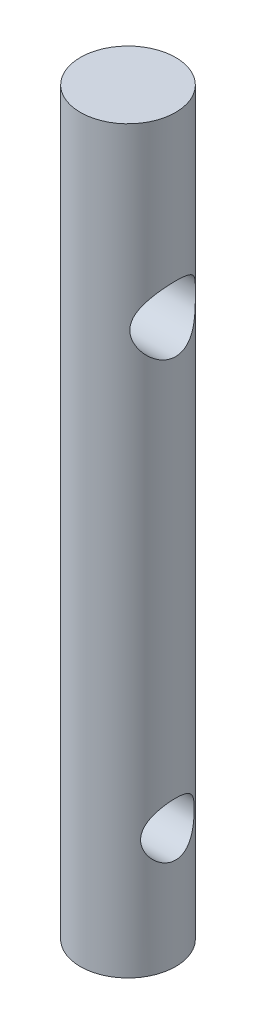
ISO-10303-21;
HEADER;
FILE_DESCRIPTION(('STEP AP214'),'2;1');
FILE_NAME('part.step','',(''),(''),'','','');
FILE_SCHEMA(('AUTOMOTIVE_DESIGN { 1 0 10303 214 1 1 1 1 }'));
ENDSEC;
DATA;
#1=APPLICATION_CONTEXT('core data for automotive mechanical design processes');
#2=APPLICATION_PROTOCOL_DEFINITION('international standard','automotive_design',2000,#1);
#3=PRODUCT_CONTEXT('',#1,'mechanical');
#4=PRODUCT('Part','Part','',(#3));
#5=PRODUCT_RELATED_PRODUCT_CATEGORY('part','',(#4));
#6=PRODUCT_DEFINITION_FORMATION('','',#4);
#7=PRODUCT_DEFINITION_CONTEXT('part definition',#1,'design');
#8=PRODUCT_DEFINITION('design','',#6,#7);
#9=PRODUCT_DEFINITION_SHAPE('','',#8);
#10=(LENGTH_UNIT() NAMED_UNIT(*) SI_UNIT(.MILLI.,.METRE.));
#11=(NAMED_UNIT(*) PLANE_ANGLE_UNIT() SI_UNIT($,.RADIAN.));
#12=(NAMED_UNIT(*) SI_UNIT($,.STERADIAN.) SOLID_ANGLE_UNIT());
#13=UNCERTAINTY_MEASURE_WITH_UNIT(LENGTH_MEASURE(1.E-05),#10,'distance_accuracy_value','');
#14=(GEOMETRIC_REPRESENTATION_CONTEXT(3) GLOBAL_UNCERTAINTY_ASSIGNED_CONTEXT((#13)) GLOBAL_UNIT_ASSIGNED_CONTEXT((#10,
#11,#12)) REPRESENTATION_CONTEXT('',''));
#15=CARTESIAN_POINT('',(0.,0.,0.));
#16=DIRECTION('',(0.,0.,1.));
#17=DIRECTION('',(1.,0.,0.));
#18=AXIS2_PLACEMENT_3D('',#15,#16,#17);
#19=CARTESIAN_POINT('',(0.,62.1,0.));
#20=DIRECTION('',(0.,-1.,0.));
#21=DIRECTION('',(0.,0.,-1.));
#22=AXIS2_PLACEMENT_3D('',#19,#20,#21);
#23=CYLINDRICAL_SURFACE('',#22,4.);
#24=CARTESIAN_POINT('',(4.,7.75000000000001,0.));
#25=CARTESIAN_POINT('',(4.00000478544653,7.74999453130518,0.116574361582472));
#26=CARTESIAN_POINT('',(3.99486161015437,7.7590981789772,0.233117494271239));
#27=CARTESIAN_POINT('',(3.97483223454772,7.79500258941546,0.462569233089477));
#28=CARTESIAN_POINT('',(3.95994512022037,7.8218050123859,0.575477497214019));
#29=CARTESIAN_POINT('',(3.92194301780639,7.89168584037628,0.794135368983557));
#30=CARTESIAN_POINT('',(3.89885841586878,7.93470417260667,0.899909720053429));
#31=CARTESIAN_POINT('',(3.84647695565079,8.03538019365043,1.10253378507156));
#32=CARTESIAN_POINT('',(3.81717856353268,8.09304149769058,1.19938128699593));
#33=CARTESIAN_POINT('',(3.75249587564385,8.22592775009536,1.38906915002198));
#34=CARTESIAN_POINT('',(3.71682789510745,8.30210554672397,1.48114339668484));
#35=CARTESIAN_POINT('',(3.64413342628144,8.46776263700002,1.65194589061997));
#36=CARTESIAN_POINT('',(3.60710555491407,8.55725577196237,1.73066006559967));
#37=CARTESIAN_POINT('',(3.53132973794817,8.7580941708652,1.88082299052421));
#38=CARTESIAN_POINT('',(3.49280663301793,8.87074581752852,1.95065199991236));
#39=CARTESIAN_POINT('',(3.42338878308605,9.10842284430669,2.07007441099025));
#40=CARTESIAN_POINT('',(3.39248289010151,9.23342976195331,2.11969745487576));
#41=CARTESIAN_POINT('',(3.34873790347699,9.46472296594284,2.18797418220357));
#42=CARTESIAN_POINT('',(3.33344311646643,9.56925606283551,2.21099236506624));
#43=CARTESIAN_POINT('',(3.31272698675541,9.78145422778595,2.24191937059644));
#44=CARTESIAN_POINT('',(3.30729555624901,9.88911598132565,2.24984363106812));
#45=CARTESIAN_POINT('',(3.30708570593103,10.1045987035378,2.25015198203818));
#46=CARTESIAN_POINT('',(3.31232016010623,10.2124197074614,2.24251729249723));
#47=CARTESIAN_POINT('',(3.33269723151075,10.4249625744304,2.21211443713199));
#48=CARTESIAN_POINT('',(3.34784644914888,10.529682324348,2.18933618985118));
#49=CARTESIAN_POINT('',(3.38603292300512,10.7333027654873,2.12979203835403));
#50=CARTESIAN_POINT('',(3.40905841136274,10.8322118814631,2.09304699274244));
#51=CARTESIAN_POINT('',(3.46051165794458,11.0227794777977,2.00683191613315));
#52=CARTESIAN_POINT('',(3.48894150865605,11.1144351301926,1.95735695367262));
#53=CARTESIAN_POINT('',(3.55335821820066,11.3030329597275,1.83818085300224));
#54=CARTESIAN_POINT('',(3.58983262447658,11.3985786540699,1.76653038669177));
#55=CARTESIAN_POINT('',(3.66310576724814,11.577175923867,1.60910062289686));
#56=CARTESIAN_POINT('',(3.69990474528988,11.6602171841263,1.52330978155465));
#57=CARTESIAN_POINT('',(3.77433344135285,11.8203414864716,1.32903508462716));
#58=CARTESIAN_POINT('',(3.81163274215655,11.8958430174917,1.21910653825672));
#59=CARTESIAN_POINT('',(3.8785102897696,12.0269493359196,0.985819808739913));
#60=CARTESIAN_POINT('',(3.90809353555846,12.0825670141272,0.862470394320824));
#61=CARTESIAN_POINT('',(3.95433282446718,12.1680512248964,0.614802935181407));
#62=CARTESIAN_POINT('',(3.97175099800325,12.1994522774439,0.491161652101949));
#63=CARTESIAN_POINT('',(3.99482968000702,12.2408638905754,0.239312439490547));
#64=CARTESIAN_POINT('',(4.0005010871484,12.2508942791528,0.111108855331867));
#65=CARTESIAN_POINT('',(3.99948985429328,12.2490900194052,-0.13004078307406));
#66=CARTESIAN_POINT('',(3.99417274413828,12.2396722780858,-0.243020002233855));
#67=CARTESIAN_POINT('',(3.97439096014101,12.2042007521307,-0.465494282379478));
#68=CARTESIAN_POINT('',(3.95992604703182,12.1781465323566,-0.574989252153744));
#69=CARTESIAN_POINT('',(3.92328872220358,12.1108014960461,-0.786967121562118));
#70=CARTESIAN_POINT('',(3.90116658018562,12.0696099498368,-0.889490661546794));
#71=CARTESIAN_POINT('',(3.85101918921102,11.9734562382392,-1.08626635912844));
#72=CARTESIAN_POINT('',(3.82299243073654,11.9184905508034,-1.18051639285429));
#73=CARTESIAN_POINT('',(3.76002936312769,11.7899122191325,-1.36857667308343));
#74=CARTESIAN_POINT('',(3.7246780024892,11.7149574830262,-1.46132919322936));
#75=CARTESIAN_POINT('',(3.65238471184595,11.5517004840577,-1.63365800644759));
#76=CARTESIAN_POINT('',(3.61544103187715,11.4633832537326,-1.71321931178773));
#77=CARTESIAN_POINT('',(3.53951439409258,11.2648897896172,-1.86542341442178));
#78=CARTESIAN_POINT('',(3.50072726004721,11.1533905499058,-1.93645169791217));
#79=CARTESIAN_POINT('',(3.43037744626153,10.9178923077855,-2.05851857364412));
#80=CARTESIAN_POINT('',(3.39880480330901,10.793910888565,-2.10958480364701));
#81=CARTESIAN_POINT('',(3.35340305197012,10.563667865818,-2.18084463813156));
#82=CARTESIAN_POINT('',(3.33723657165908,10.4591803754072,-2.20527701624258));
#83=CARTESIAN_POINT('',(3.31471067608655,10.2467957415048,-2.23899995281605));
#84=CARTESIAN_POINT('',(3.30834087137768,10.1389023341522,-2.24830655287419));
#85=CARTESIAN_POINT('',(3.30632360585781,9.92262955911016,-2.25127274506087));
#86=CARTESIAN_POINT('',(3.31069292179551,9.81424969541507,-2.24490785502245));
#87=CARTESIAN_POINT('',(3.32953789725069,9.60037404467416,-2.21685577078293));
#88=CARTESIAN_POINT('',(3.34402001448016,9.4948801452687,-2.19515878588968));
#89=CARTESIAN_POINT('',(3.38097911212604,9.29037151006926,-2.13778330318558));
#90=CARTESIAN_POINT('',(3.40338287245248,9.19130695507592,-2.10223255881956));
#91=CARTESIAN_POINT('',(3.45375909402076,9.00026943468902,-2.01839895296499));
#92=CARTESIAN_POINT('',(3.48173366583132,8.90829917543204,-1.9701112636748));
#93=CARTESIAN_POINT('',(3.54527276452029,8.71915337792142,-1.85366513948028));
#94=CARTESIAN_POINT('',(3.58134425635897,8.62332096321644,-1.78359984700069));
#95=CARTESIAN_POINT('',(3.65407566781854,8.44388148560471,-1.62941913124429));
#96=CARTESIAN_POINT('',(3.69073604531761,8.36028450307825,-1.54529224392736));
#97=CARTESIAN_POINT('',(3.76540884250455,8.19818149303695,-1.354021465717));
#98=CARTESIAN_POINT('',(3.80310734128129,8.12131329772804,-1.24535169109797));
#99=CARTESIAN_POINT('',(3.87110760658433,7.98721203787693,-1.01438833074298));
#100=CARTESIAN_POINT('',(3.90141321037509,7.92996878077582,-0.892101860933931));
#101=CARTESIAN_POINT('',(3.94980432815978,7.84018245187761,-0.643615229722407));
#102=CARTESIAN_POINT('',(3.9684273957593,7.80654270214637,-0.517920543452162));
#103=CARTESIAN_POINT('',(3.99351673701052,7.76146515633489,-0.261467507514435));
#104=CARTESIAN_POINT('',(3.99999463410795,7.75000613201422,-0.130714121712679));
#105=CARTESIAN_POINT('',(4.,7.75000000000001,0.));
#106=B_SPLINE_CURVE_WITH_KNOTS('',3,(#24,#25,#26,#27,#28,#29,#30,#31,#32,#33,#34,#35,#36,#37,
#38,#39,#40,#41,#42,#43,#44,#45,#46,#47,#48,#49,#50,#51,#52,#53,#54,#55,#56,#57,#58,#59,#60,#61,
#62,#63,#64,#65,#66,#67,#68,#69,#70,#71,#72,#73,#74,#75,#76,#77,#78,#79,#80,#81,#82,#83,#84,#85,
#86,#87,#88,#89,#90,#91,#92,#93,#94,#95,#96,#97,#98,#99,#100,#101,#102,#103,#104,#105),
.UNSPECIFIED.,.T.,.F.,(4,2,2,2,2,2,2,2,2,2,2,2,2,2,2,2,2,2,2,2,2,2,2,2,2,2,2,2,2,2,2,2,2,2,2,2,
2,2,2,2,4),(0.,0.349217040261903,0.698466842902346,1.04643534535527,1.39448984197479,
1.76712658025474,2.14015341686606,2.5521761075332,2.96359216327473,3.28655752035713,
3.60919237628562,3.93221689114865,4.25545666737862,4.57821558845878,4.90109973238011,
5.27422406620246,5.64765453225214,6.06093560472621,6.47394825708697,6.85794726055586,
7.24158982908579,7.58042476019115,7.91926855411823,8.25592875611158,8.59267513010329,
8.96431825134707,9.33638077847353,9.74768136660233,10.158410468765,10.4825563002443,
10.8063581350408,11.1306661373325,11.4551814219642,11.7767724027847,12.0984854548004,
12.4692322109723,12.8402827146263,13.2531861325241,13.6658747756936,14.0578250211793,
14.4493999617175),.UNSPECIFIED.);
#107=CARTESIAN_POINT('',(4.,7.75000000000001,0.));
#108=VERTEX_POINT('',#107);
#109=EDGE_CURVE('E10',#108,#108,#106,.T.);
#110=ORIENTED_EDGE('',*,*,#109,.T.);
#111=EDGE_LOOP('',(#110));
#112=FACE_BOUND('',#111,.T.);
#113=CARTESIAN_POINT('',(-3.30718913883074,10.,2.24999999999999));
#114=CARTESIAN_POINT('',(-3.30720283164235,9.88520822701399,2.24998998597615));
#115=CARTESIAN_POINT('',(-3.31326199057818,9.77032319902401,2.24115272144871));
#116=CARTESIAN_POINT('',(-3.33653258979889,9.54428040268576,2.20634454496227));
#117=CARTESIAN_POINT('',(-3.35376180964137,9.43312887419174,2.18034631643425));
#118=CARTESIAN_POINT('',(-3.39669677819684,9.21828250266168,2.11282374112489));
#119=CARTESIAN_POINT('',(-3.42234732234414,9.11454431690225,2.07140028056063));
#120=CARTESIAN_POINT('',(-3.47914410853277,8.91553589249748,1.97451321653586));
#121=CARTESIAN_POINT('',(-3.51029165708196,8.82026767507596,1.91904627390682));
#122=CARTESIAN_POINT('',(-3.57858292165988,8.62978631391552,1.78877118435164));
#123=CARTESIAN_POINT('',(-3.61601218998279,8.53565168519916,1.71253525749273));
#124=CARTESIAN_POINT('',(-3.69035883366655,8.36063158701421,1.54582974413932));
#125=CARTESIAN_POINT('',(-3.72727587335664,8.27975446175999,1.45535126312722));
#126=CARTESIAN_POINT('',(-3.80043905611031,8.12628851476165,1.25270944953698));
#127=CARTESIAN_POINT('',(-3.83631825888132,8.05512422844991,1.13932192166405));
#128=CARTESIAN_POINT('',(-3.89944625108567,7.93338570613169,0.899782666076097));
#129=CARTESIAN_POINT('',(-3.92670191534241,7.88279505926147,0.773641212406467));
#130=CARTESIAN_POINT('',(-3.96741508551211,7.8082500957617,0.523681584622888));
#131=CARTESIAN_POINT('',(-3.98185970105235,7.78237518549638,0.400600921300551));
#132=CARTESIAN_POINT('',(-3.9990959232521,7.75156921051223,0.151075971454805));
#133=CARTESIAN_POINT('',(-4.0018968673342,7.74662136367429,0.0246344620294684));
#134=CARTESIAN_POINT('',(-3.99589303432293,7.75730848266808,-0.213146431029538));
#135=CARTESIAN_POINT('',(-3.98832428191024,7.77075111662831,-0.324624825144539));
#136=CARTESIAN_POINT('',(-3.96444074773096,7.8137679790799,-0.543435301884435));
#137=CARTESIAN_POINT('',(-3.94812528853831,7.84334345705135,-0.650767062665244));
#138=CARTESIAN_POINT('',(-3.90798978670721,7.91772458957311,-0.859682291790886));
#139=CARTESIAN_POINT('',(-3.88409842608767,7.96267531365288,-0.961199838960673));
#140=CARTESIAN_POINT('',(-3.83081347415684,8.06619567475389,-1.155432954149));
#141=CARTESIAN_POINT('',(-3.80141819640327,8.12476948732926,-1.24814581118481));
#142=CARTESIAN_POINT('',(-3.73587457924302,8.26125437019958,-1.43314551789953));
#143=CARTESIAN_POINT('',(-3.69933884152572,8.34058984718902,-1.52424389574508));
#144=CARTESIAN_POINT('',(-3.62542637052535,8.51263634619458,-1.69255803147124));
#145=CARTESIAN_POINT('',(-3.58804875665274,8.60536198015369,-1.76975841374624));
#146=CARTESIAN_POINT('',(-3.51263905953386,8.8120334436418,-1.91538550764547));
#147=CARTESIAN_POINT('',(-3.47487862633156,8.92715634881863,-1.98229476058775));
#148=CARTESIAN_POINT('',(-3.40788863495859,9.16956083210203,-2.09539020948197));
#149=CARTESIAN_POINT('',(-3.37864921243183,9.29682812275862,-2.14160040128731));
#150=CARTESIAN_POINT('',(-3.34594244401029,9.4887065817242,-2.192034467537));
#151=CARTESIAN_POINT('',(-3.33707999891524,9.5500976490126,-2.20546205088502));
#152=CARTESIAN_POINT('',(-3.32263419547036,9.67414906438363,-2.22716773841207));
#153=CARTESIAN_POINT('',(-3.31704887169847,9.73680862832017,-2.23544892926733));
#154=CARTESIAN_POINT('',(-3.30943885611997,9.86276708191362,-2.24670015251964));
#155=CARTESIAN_POINT('',(-3.30741116514912,9.92606538777096,-2.2496746586066));
#156=CARTESIAN_POINT('',(-3.30700126925191,10.0526779848783,-2.25027513604798));
#157=CARTESIAN_POINT('',(-3.30861861678419,10.1159922732116,-2.24790176402007));
#158=CARTESIAN_POINT('',(-3.3177883182366,10.2853682614947,-2.23437139368501));
#159=CARTESIAN_POINT('',(-3.32865531872577,10.3909074810053,-2.21829925748997));
#160=CARTESIAN_POINT('',(-3.35915029085187,10.5973960787567,-2.17183241579351));
#161=CARTESIAN_POINT('',(-3.37878247892555,10.6983432222265,-2.14143081680422));
#162=CARTESIAN_POINT('',(-3.42541559308764,10.8976287403227,-2.06604953338091));
#163=CARTESIAN_POINT('',(-3.45267969832011,10.9957015414302,-2.02053570089111));
#164=CARTESIAN_POINT('',(-3.51140559505348,11.1834001059593,-1.9166607669257));
#165=CARTESIAN_POINT('',(-3.54286939186899,11.2730217989495,-1.85829351935498));
#166=CARTESIAN_POINT('',(-3.61274572393316,11.4569968907179,-1.71903976804869));
#167=CARTESIAN_POINT('',(-3.65144050737585,11.5496360940029,-1.63601976355696));
#168=CARTESIAN_POINT('',(-3.72711451802446,11.7203905482922,-1.45540802432558));
#169=CARTESIAN_POINT('',(-3.7640926038568,11.7984962373817,-1.35780677185052));
#170=CARTESIAN_POINT('',(-3.83478893396541,11.9422273955657,-1.14360035664466));
#171=CARTESIAN_POINT('',(-3.86819366431951,12.0068661250331,-1.02622124804744));
#172=CARTESIAN_POINT('',(-3.92526975055171,12.114792761153,-0.779859627517685));
#173=CARTESIAN_POINT('',(-3.94895155673933,12.1581036013043,-0.650889756225636));
#174=CARTESIAN_POINT('',(-3.98181720818824,12.2176365800725,-0.39939417087923));
#175=CARTESIAN_POINT('',(-3.99225029320362,12.2362029496347,-0.277588091417815));
#176=CARTESIAN_POINT('',(-4.00175085795284,12.2531237698982,-0.0321628312108966));
#177=CARTESIAN_POINT('',(-4.00082496337144,12.2514900033202,0.0914552505650953));
#178=CARTESIAN_POINT('',(-3.98836885014083,12.2292712299996,0.324371969616517));
#179=CARTESIAN_POINT('',(-3.97786263096405,12.2105160452426,0.433908228040755));
#180=CARTESIAN_POINT('',(-3.94864297115619,12.1574916310493,0.647992387009644));
#181=CARTESIAN_POINT('',(-3.92992859291156,12.1232206292352,0.752539716158407));
#182=CARTESIAN_POINT('',(-3.8851790215306,12.0392195302406,0.957461424570643));
#183=CARTESIAN_POINT('',(-3.85893435926781,11.9890420351136,1.05760509220294));
#184=CARTESIAN_POINT('',(-3.80152063128717,11.8752264156033,1.24835010087801));
#185=CARTESIAN_POINT('',(-3.77034969355758,11.8115831710339,1.33894779249536));
#186=CARTESIAN_POINT('',(-3.70159253175978,11.6640425233382,1.51940733681764));
#187=CARTESIAN_POINT('',(-3.66368342092732,11.5786407836775,1.60791870144064));
#188=CARTESIAN_POINT('',(-3.58816213218351,11.394449187984,1.77005940844377));
#189=CARTESIAN_POINT('',(-3.55055040037759,11.2956422041524,1.84366940658887));
#190=CARTESIAN_POINT('',(-3.47685328195418,11.0780574809745,1.97937004601133));
#191=CARTESIAN_POINT('',(-3.44110222482128,10.9583319364605,2.04015665405133));
#192=CARTESIAN_POINT('',(-3.39524856105545,10.7706465310558,2.1149804762536));
#193=CARTESIAN_POINT('',(-3.38126734349664,10.7067879488962,2.13718482131852));
#194=CARTESIAN_POINT('',(-3.35650182497846,10.5767748162433,2.17587286857109));
#195=CARTESIAN_POINT('',(-3.34571555488442,10.5106217081363,2.19236009545121));
#196=CARTESIAN_POINT('',(-3.32716265076413,10.3710426800349,2.22042804423415));
#197=CARTESIAN_POINT('',(-3.31971941034423,10.2974676618824,2.23149039731192));
#198=CARTESIAN_POINT('',(-3.30972844736887,10.1492748405785,2.24627926344474));
#199=CARTESIAN_POINT('',(-3.30718023343478,10.0746571428523,2.2500065128222));
#200=CARTESIAN_POINT('',(-3.30718913883074,10.,2.24999999999999));
#201=B_SPLINE_CURVE_WITH_KNOTS('',3,(#113,#114,#115,#116,#117,#118,#119,#120,#121,#122,#123,
#124,#125,#126,#127,#128,#129,#130,#131,#132,#133,#134,#135,#136,#137,#138,#139,#140,#141,#142,
#143,#144,#145,#146,#147,#148,#149,#150,#151,#152,#153,#154,#155,#156,#157,#158,#159,#160,#161,
#162,#163,#164,#165,#166,#167,#168,#169,#170,#171,#172,#173,#174,#175,#176,#177,#178,#179,#180,
#181,#182,#183,#184,#185,#186,#187,#188,#189,#190,#191,#192,#193,#194,#195,#196,#197,#198,#199,
#200),.UNSPECIFIED.,.T.,.F.,(4,2,2,2,2,2,2,2,2,2,2,2,2,2,2,2,2,2,2,2,2,2,2,2,2,2,2,2,2,2,2,2,2,
2,2,2,2,2,2,2,2,2,2,4),(0.,0.344066805660246,0.688682616793039,1.03108301796517,
1.37356490947821,1.75238780208417,2.13144821620348,2.54501229302032,2.95824583428632,
3.33584820031542,3.71314769676886,4.04917469578036,4.38522772359824,4.72454320749746,
5.0639628309026,5.4410397698117,5.81853134594494,6.23167855500206,6.64434556637781,
6.83448583066615,7.02451194328459,7.2143777825175,7.40422031110857,7.72451713226546,
8.04496819642207,8.37822852327225,8.71164855199208,9.10081491651467,9.49023642367203,
9.9022468970615,10.3138133702467,10.6826803049524,11.0513320900709,11.3846804478632,
11.7180668937784,12.0618158383276,12.4056957248518,12.7901872703696,13.1751747879601,
13.5894788153596,13.7963097822762,14.0030130070155,14.2268062539982,14.4505770347146),.UNSPECIFIED.);
#202=CARTESIAN_POINT('',(-3.30718913883074,10.,2.24999999999999));
#203=VERTEX_POINT('',#202);
#204=EDGE_CURVE('E45',#203,#203,#201,.T.);
#205=ORIENTED_EDGE('',*,*,#204,.T.);
#206=EDGE_LOOP('',(#205));
#207=FACE_BOUND('',#206,.T.);
#208=CARTESIAN_POINT('',(4.,44.35,0.));
#209=CARTESIAN_POINT('',(3.99999802179678,44.3500023224489,0.137258074424081));
#210=CARTESIAN_POINT('',(3.99287327892844,44.3603354618588,0.274528526134901));
#211=CARTESIAN_POINT('',(3.96507381498766,44.401013791653,0.544665032020234));
#212=CARTESIAN_POINT('',(3.94439199951864,44.4313694598496,0.677528741887481));
#213=CARTESIAN_POINT('',(3.89150469875463,44.5101823741354,0.934526819392482));
#214=CARTESIAN_POINT('',(3.85935519703375,44.5585517297199,1.05870014966306));
#215=CARTESIAN_POINT('',(3.78607131100721,44.6712826302398,1.29660312511032));
#216=CARTESIAN_POINT('',(3.74493574873881,44.735646271983,1.41033139828873));
#217=CARTESIAN_POINT('',(3.65264042174503,44.8845983554352,1.63531621144266));
#218=CARTESIAN_POINT('',(3.6009196176269,44.970460096443,1.74549465388044));
#219=CARTESIAN_POINT('',(3.49392164689622,45.1568537436125,1.95088567284353));
#220=CARTESIAN_POINT('',(3.43863930195452,45.2574072930177,2.04607573180857));
#221=CARTESIAN_POINT('',(3.31933398273712,45.4899897815388,2.23528976305894));
#222=CARTESIAN_POINT('',(3.25541452110447,45.6244657043836,2.3263920459519));
#223=CARTESIAN_POINT('',(3.13625704801089,45.9103015201617,2.48469250489989));
#224=CARTESIAN_POINT('',(3.08100432131252,46.0616320317341,2.5519314491151));
#225=CARTESIAN_POINT('',(3.00298418866649,46.3308636974928,2.64282710642558));
#226=CARTESIAN_POINT('',(2.975446569544,46.4449922450112,2.67351649276376));
#227=CARTESIAN_POINT('',(2.93294047429676,46.6784216130205,2.72008735416347));
#228=CARTESIAN_POINT('',(2.91794861674901,46.7977123742017,2.7359963813753));
#229=CARTESIAN_POINT('',(2.90287741461782,47.0389479719762,2.75198908833717));
#230=CARTESIAN_POINT('',(2.90287386084158,47.1609031790804,2.75199233793689));
#231=CARTESIAN_POINT('',(2.91797704579614,47.4028348194417,2.73596672695866));
#232=CARTESIAN_POINT('',(2.93309458767243,47.5228097756309,2.71992640417939));
#233=CARTESIAN_POINT('',(2.97471086064014,47.7505966642496,2.67431514861646));
#234=CARTESIAN_POINT('',(3.00050715469395,47.8587115452862,2.64557295787058));
#235=CARTESIAN_POINT('',(3.06032455130249,48.0686219474742,2.57614314228268));
#236=CARTESIAN_POINT('',(3.09435209476917,48.1704124410404,2.53544615750149));
#237=CARTESIAN_POINT('',(3.18619095764932,48.416505896922,2.41991789501478));
#238=CARTESIAN_POINT('',(3.24734218494334,48.5563583128746,2.33822296262311));
#239=CARTESIAN_POINT('',(3.37323464914222,48.8188641409838,2.15265251371016));
#240=CARTESIAN_POINT('',(3.43798261441589,48.941483693008,2.04873431410758));
#241=CARTESIAN_POINT('',(3.56489438342115,49.1687958934884,1.8190448444789));
#242=CARTESIAN_POINT('',(3.62702677774034,49.2733017879403,1.69307008311931));
#243=CARTESIAN_POINT('',(3.74170737193468,49.4597152010139,1.42169433803434));
#244=CARTESIAN_POINT('',(3.79427535126369,49.5416695410169,1.27633454794215));
#245=CARTESIAN_POINT('',(3.87413124501433,49.6637878500843,1.00331090090082));
#246=CARTESIAN_POINT('',(3.90444011038642,49.7091889574979,0.878871353895331));
#247=CARTESIAN_POINT('',(3.9533944029293,49.781894412276,0.622606859270788));
#248=CARTESIAN_POINT('',(3.97204773755766,49.8092110294452,0.490786984982302));
#249=CARTESIAN_POINT('',(3.99605843919119,49.8442939040009,0.222854469202538));
#250=CARTESIAN_POINT('',(4.00136767382952,49.8519893891101,0.0867280758773591));
#251=CARTESIAN_POINT('',(3.99802879207881,49.8471327061664,-0.184993945691424));
#252=CARTESIAN_POINT('',(3.98938043823091,49.8345801936367,-0.320589564865686));
#253=CARTESIAN_POINT('',(3.95985257745925,49.7913121085049,-0.579271679163973));
#254=CARTESIAN_POINT('',(3.93970570847107,49.7616835299138,-0.702628959861462));
#255=CARTESIAN_POINT('',(3.88937232371126,49.6865983635529,-0.942222757417154));
#256=CARTESIAN_POINT('',(3.85918395388224,49.6411388526954,-1.05845795456065));
#257=CARTESIAN_POINT('',(3.78822166183065,49.5320716542286,-1.29042886593137));
#258=CARTESIAN_POINT('',(3.74681072893145,49.4673343774466,-1.40543413614198));
#259=CARTESIAN_POINT('',(3.65765620494193,49.3235403293923,-1.62340548658119));
#260=CARTESIAN_POINT('',(3.60990810463132,49.2444733470165,-1.72636289505436));
#261=CARTESIAN_POINT('',(3.50275027487973,49.0591905074991,-1.93566140246306));
#262=CARTESIAN_POINT('',(3.44273388920179,48.950644683033,-2.03963079432544));
#263=CARTESIAN_POINT('',(3.32337820310584,48.7178236916551,-2.22882643868158));
#264=CARTESIAN_POINT('',(3.26403930857859,48.593539584806,-2.31404196234976));
#265=CARTESIAN_POINT('',(3.15927034505923,48.3467395904993,-2.45473433878153));
#266=CARTESIAN_POINT('',(3.11302851237539,48.2259339133307,-2.51259393625802));
#267=CARTESIAN_POINT('',(3.03109134483779,47.9741183823095,-2.61086105953504));
#268=CARTESIAN_POINT('',(2.9953753025747,47.8431292131676,-2.65130292462334));
#269=CARTESIAN_POINT('',(2.94500921367962,47.5973271513626,-2.707043709125));
#270=CARTESIAN_POINT('',(2.92773967019417,47.4837901702191,-2.72553848443294));
#271=CARTESIAN_POINT('',(2.90658324568062,47.254098286924,-2.74809614645989));
#272=CARTESIAN_POINT('',(2.90268247823535,47.1379462274592,-2.7521740084565));
#273=CARTESIAN_POINT('',(2.90887607732054,46.906448997056,-2.74562438313271));
#274=CARTESIAN_POINT('',(2.91897122478487,46.7911038715033,-2.73499607524819));
#275=CARTESIAN_POINT('',(2.9515746338111,46.5643199936644,-2.69977082517026));
#276=CARTESIAN_POINT('',(2.97410067345067,46.4528870797715,-2.67515387557641));
#277=CARTESIAN_POINT('',(3.03705127242402,46.2027672533418,-2.60369081252696));
#278=CARTESIAN_POINT('',(3.08084930141243,46.0662328730189,-2.55233752625962));
#279=CARTESIAN_POINT('',(3.17778378380083,45.8055729015977,-2.43058449576001));
#280=CARTESIAN_POINT('',(3.23093442264496,45.6814666158133,-2.36015573028727));
#281=CARTESIAN_POINT('',(3.34192584310095,45.4440421752507,-2.20027320916286));
#282=CARTESIAN_POINT('',(3.39984323658229,45.3310156411304,-2.11044068650409));
#283=CARTESIAN_POINT('',(3.51428362822336,45.119964447554,-1.91384182386472));
#284=CARTESIAN_POINT('',(3.57080617996259,45.0219445400628,-1.80707014167165));
#285=CARTESIAN_POINT('',(3.68593402394947,44.8294474531382,-1.56042793750817));
#286=CARTESIAN_POINT('',(3.74362233697919,44.7376130543771,-1.41799891180798));
#287=CARTESIAN_POINT('',(3.81947694246508,44.6197203579666,-1.19080043447));
#288=CARTESIAN_POINT('',(3.84297971412612,44.5837361280252,-1.11281989554293));
#289=CARTESIAN_POINT('',(3.88573469001762,44.5189090345792,-0.952845533160086));
#290=CARTESIAN_POINT('',(3.90498859316556,44.490063316166,-0.870853329855587));
#291=CARTESIAN_POINT('',(3.94706099510282,44.4274392063147,-0.661185111450658));
#292=CARTESIAN_POINT('',(3.96676443012476,44.398533749394,-0.531360427174713));
#293=CARTESIAN_POINT('',(3.99323020184083,44.359819942686,-0.267692426931683));
#294=CARTESIAN_POINT('',(4.00000192911531,44.3499977351812,-0.13385209878505));
#295=CARTESIAN_POINT('',(4.,44.35,0.));
#296=B_SPLINE_CURVE_WITH_KNOTS('',3,(#208,#209,#210,#211,#212,#213,#214,#215,#216,#217,#218,
#219,#220,#221,#222,#223,#224,#225,#226,#227,#228,#229,#230,#231,#232,#233,#234,#235,#236,#237,
#238,#239,#240,#241,#242,#243,#244,#245,#246,#247,#248,#249,#250,#251,#252,#253,#254,#255,#256,
#257,#258,#259,#260,#261,#262,#263,#264,#265,#266,#267,#268,#269,#270,#271,#272,#273,#274,#275,
#276,#277,#278,#279,#280,#281,#282,#283,#284,#285,#286,#287,#288,#289,#290,#291,#292,#293,#294,
#295),.UNSPECIFIED.,.T.,.F.,(4,2,2,2,2,2,2,2,2,2,2,2,2,2,2,2,2,2,2,2,2,2,2,2,2,2,2,2,2,2,2,2,2,
2,2,2,2,2,2,2,2,2,2,4),(0.,0.411245816056878,0.82270700844216,1.23218639702044,1.64171949558855,
2.08692329951561,2.5327896948124,3.05408633908028,3.57448806315156,3.93713487590616,
4.29910431228801,4.66290410408945,5.02696399551614,5.37014494388993,5.71359530329574,
6.23026126529819,6.7479286191045,7.27065113156463,7.79228003905403,8.19823107751697,
8.603906406881,9.01104292669307,9.41818637314535,9.80189589133772,10.1856762968161,
10.5990666674811,11.0127527796346,11.496391128827,11.9803054456371,12.4039074741258,
12.8266704995928,13.174111962916,13.5211924222275,13.8682922484615,14.2158897718786,
14.6703437022929,15.1254929561873,15.5904929868139,16.0556399601097,16.5892193961287,
16.8559371007637,17.1225479638393,17.5238805105485,17.9249215117919),.UNSPECIFIED.);
#297=CARTESIAN_POINT('',(4.,44.35,0.));
#298=VERTEX_POINT('',#297);
#299=EDGE_CURVE('E49',#298,#298,#296,.T.);
#300=ORIENTED_EDGE('',*,*,#299,.T.);
#301=EDGE_LOOP('',(#300));
#302=FACE_BOUND('',#301,.T.);
#303=CARTESIAN_POINT('',(-2.90473750965557,47.1,2.75));
#304=CARTESIAN_POINT('',(-2.90473198064088,47.0335495866102,2.75000294692252));
#305=CARTESIAN_POINT('',(-2.90702795608042,46.9671228083841,2.74758673979103));
#306=CARTESIAN_POINT('',(-2.91606195945841,46.8349121710439,2.73799653309983));
#307=CARTESIAN_POINT('',(-2.92280095050396,46.769128454464,2.73082150197357));
#308=CARTESIAN_POINT('',(-2.94925701130347,46.5734488899272,2.70233009704605));
#309=CARTESIAN_POINT('',(-2.97521232531221,46.4453361361051,2.67404777571551));
#310=CARTESIAN_POINT('',(-3.03900524579541,46.1987680647133,2.60128997710139));
#311=CARTESIAN_POINT('',(-3.07671549075611,46.0802256166363,2.55698728928615));
#312=CARTESIAN_POINT('',(-3.15952328189664,45.85246892811,2.45393338182809));
#313=CARTESIAN_POINT('',(-3.20462176801536,45.7432558772486,2.39518032331831));
#314=CARTESIAN_POINT('',(-3.3061674836544,45.5172496038593,2.25345371728625));
#315=CARTESIAN_POINT('',(-3.36325017838268,45.4022520061141,2.16807144153411));
#316=CARTESIAN_POINT('',(-3.47708193715567,45.1866341201965,1.98040498596113));
#317=CARTESIAN_POINT('',(-3.53383053370817,45.0860307796585,1.87810118341567));
#318=CARTESIAN_POINT('',(-3.65116725282365,44.8861641227712,1.63987546408471));
#319=CARTESIAN_POINT('',(-3.71094413985639,44.7896268332174,1.50119568752089));
#320=CARTESIAN_POINT('',(-3.79079668260262,44.6640898368351,1.27909404458481));
#321=CARTESIAN_POINT('',(-3.81577443649177,44.6254618667645,1.20273101258975));
#322=CARTESIAN_POINT('',(-3.86174723865856,44.5551418478903,1.04574868103351));
#323=CARTESIAN_POINT('',(-3.88274393741235,44.5234469239253,0.965131163106622));
#324=CARTESIAN_POINT('',(-3.92892982933635,44.4542592928058,0.760946462261465));
#325=CARTESIAN_POINT('',(-3.9513590217141,44.4211854959415,0.635197554078259));
#326=CARTESIAN_POINT('',(-3.98411368905139,44.3731020495439,0.378840351162922));
#327=CARTESIAN_POINT('',(-3.99444861806458,44.3580782900989,0.248235934485041));
#328=CARTESIAN_POINT('',(-4.00213368032737,44.3468940975365,-0.0144164247160802));
#329=CARTESIAN_POINT('',(-3.99946054471519,44.3507674676883,-0.146466532153536));
#330=CARTESIAN_POINT('',(-3.98131682842819,44.3772303870801,-0.407782987911139));
#331=CARTESIAN_POINT('',(-3.96584256183324,44.3998253269571,-0.537048523449137));
#332=CARTESIAN_POINT('',(-3.92387926530989,44.4618499470395,-0.786694391897015));
#333=CARTESIAN_POINT('',(-3.89761828827691,44.5009315037911,-0.907201220836481));
#334=CARTESIAN_POINT('',(-3.83608084696039,44.5941588678721,-1.13972273801847));
#335=CARTESIAN_POINT('',(-3.80080265204358,44.6483075671461,-1.25173579073236));
#336=CARTESIAN_POINT('',(-3.71916599226858,44.7767622390801,-1.47777611786169));
#337=CARTESIAN_POINT('',(-3.67200714553425,44.8526514515589,-1.59060980530461));
#338=CARTESIAN_POINT('',(-3.57268438926105,45.0188897655156,-1.80268426189685));
#339=CARTESIAN_POINT('',(-3.52051487235065,45.1092551443824,-1.90190949341995));
#340=CARTESIAN_POINT('',(-3.40555201367706,45.3197219166527,-2.10182965750515));
#341=CARTESIAN_POINT('',(-3.34248265149041,45.442262987644,-2.19980683700601));
#342=CARTESIAN_POINT('',(-3.22079935762635,45.7037771675163,-2.37439574733297));
#343=CARTESIAN_POINT('',(-3.16218351088953,45.8427431470576,-2.45101669982375));
#344=CARTESIAN_POINT('',(-3.06985150644926,46.1013034340329,-2.56516776559282));
#345=CARTESIAN_POINT('',(-3.03352182290104,46.2177611948258,-2.60765379677403));
#346=CARTESIAN_POINT('',(-2.97255662248859,46.4581067529872,-2.67694852169183));
#347=CARTESIAN_POINT('',(-2.94789942816848,46.5819802922191,-2.70378629809668));
#348=CARTESIAN_POINT('',(-2.91402835535471,46.835589430632,-2.74027500539673));
#349=CARTESIAN_POINT('',(-2.9049547735456,46.9653675965048,-2.74976984868658));
#350=CARTESIAN_POINT('',(-2.90452825674454,47.2249844858989,-2.7502216894766));
#351=CARTESIAN_POINT('',(-2.91317311997954,47.3548231998918,-2.74118099028594));
#352=CARTESIAN_POINT('',(-2.94434926540361,47.5940314925111,-2.70762201070328));
#353=CARTESIAN_POINT('',(-2.96503845737167,47.7039520953783,-2.68514786715221));
#354=CARTESIAN_POINT('',(-3.0159758478573,47.9182054741816,-2.62780497251298));
#355=CARTESIAN_POINT('',(-3.04623331624765,48.0225327160778,-2.59292419760993));
#356=CARTESIAN_POINT('',(-3.128802270949,48.271036093594,-2.49328234512097));
#357=CARTESIAN_POINT('',(-3.18485126317091,48.4114200146703,-2.42215897470927));
#358=CARTESIAN_POINT('',(-3.30285223323737,48.6765371839558,-2.25862124245922));
#359=CARTESIAN_POINT('',(-3.36481528957519,48.8012400037332,-2.16616644376171));
#360=CARTESIAN_POINT('',(-3.48907337944826,49.0354881012175,-1.95987452923078));
#361=CARTESIAN_POINT('',(-3.55135807642163,49.1447614306256,-1.84572137024282));
#362=CARTESIAN_POINT('',(-3.66931469592911,49.3433751483669,-1.59838734955969));
#363=CARTESIAN_POINT('',(-3.72499671019293,49.4327461444946,-1.46523622960126));
#364=CARTESIAN_POINT('',(-3.81586222877054,49.5750252133244,-1.20611135034299));
#365=CARTESIAN_POINT('',(-3.85292225597236,49.6315530399798,-1.08279011011346));
#366=CARTESIAN_POINT('',(-3.91587366149099,49.7263719302123,-0.826610331418726));
#367=CARTESIAN_POINT('',(-3.94177207647989,49.7646744852302,-0.693757863585672));
#368=CARTESIAN_POINT('',(-3.98015665297278,49.8211360239865,-0.421161645519001));
#369=CARTESIAN_POINT('',(-3.99257289008268,49.8391900056213,-0.281385862405601));
#370=CARTESIAN_POINT('',(-4.00247001227981,49.8535971746554,-0.000197168138952832));
#371=CARTESIAN_POINT('',(-3.9999551027707,49.8499564724286,0.141215270846849));
#372=CARTESIAN_POINT('',(-3.9811431302808,49.8225138742717,0.408523449972923));
#373=CARTESIAN_POINT('',(-3.96606685797665,49.8004975187555,0.534697056192416));
#374=CARTESIAN_POINT('',(-3.92498673550655,49.7397952461404,0.781081492409226));
#375=CARTESIAN_POINT('',(-3.89898067172028,49.7011059522161,0.901291108997325));
#376=CARTESIAN_POINT('',(-3.83661085278699,49.6066703452933,1.13847688117828));
#377=CARTESIAN_POINT('',(-3.79983692112565,49.5502403268098,1.25506978863168));
#378=CARTESIAN_POINT('',(-3.71907100266056,49.4230160418926,1.47733275245064));
#379=CARTESIAN_POINT('',(-3.67507740914039,49.3522185771903,1.58300036886995));
#380=CARTESIAN_POINT('',(-3.57532522103832,49.1858038177208,1.79811775417849));
#381=CARTESIAN_POINT('',(-3.51880480323714,49.088033802447,1.90554413491086));
#382=CARTESIAN_POINT('',(-3.40408968261463,48.8771312930833,2.10363682097361));
#383=CARTESIAN_POINT('',(-3.34589153813238,48.7639651414903,2.19426534948673));
#384=CARTESIAN_POINT('',(-3.25730450075065,48.5751902009284,2.32232421387836));
#385=CARTESIAN_POINT('',(-3.22568380103127,48.5042629097194,2.36591105822868));
#386=CARTESIAN_POINT('',(-3.16472453643961,48.3579389456578,2.44685127557784));
#387=CARTESIAN_POINT('',(-3.1353866380374,48.2825409788159,2.48420283178577));
#388=CARTESIAN_POINT('',(-3.08035979370011,48.1277765998556,2.55211490053559));
#389=CARTESIAN_POINT('',(-3.05465920277611,48.0484240051396,2.58269727080884));
#390=CARTESIAN_POINT('',(-3.00818932039303,47.8859727832352,2.636677000848));
#391=CARTESIAN_POINT('',(-2.98741593519702,47.8028773345669,2.66008033004929));
#392=CARTESIAN_POINT('',(-2.9489872458057,47.6182280082546,2.70267490800441));
#393=CARTESIAN_POINT('',(-2.93257164522108,47.516049750215,2.72034328509567));
#394=CARTESIAN_POINT('',(-2.91045586469521,47.3092266371365,2.74399834826384));
#395=CARTESIAN_POINT('',(-2.90474621158376,47.2045840457781,2.74999536193885));
#396=CARTESIAN_POINT('',(-2.90473750965557,47.1,2.75));
#397=B_SPLINE_CURVE_WITH_KNOTS('',3,(#303,#304,#305,#306,#307,#308,#309,#310,#311,#312,#313,
#314,#315,#316,#317,#318,#319,#320,#321,#322,#323,#324,#325,#326,#327,#328,#329,#330,#331,#332,
#333,#334,#335,#336,#337,#338,#339,#340,#341,#342,#343,#344,#345,#346,#347,#348,#349,#350,#351,
#352,#353,#354,#355,#356,#357,#358,#359,#360,#361,#362,#363,#364,#365,#366,#367,#368,#369,#370,
#371,#372,#373,#374,#375,#376,#377,#378,#379,#380,#381,#382,#383,#384,#385,#386,#387,#388,#389,
#390,#391,#392,#393,#394,#395,#396),.UNSPECIFIED.,.T.,.F.,(4,2,2,2,2,2,2,2,2,2,2,2,2,2,2,2,2,2,
2,2,2,2,2,2,2,2,2,2,2,2,2,2,2,2,2,2,2,2,2,2,2,2,2,2,2,2,4),(0.,0.199222175429551,
0.398487550213895,0.797347171828614,1.19202724513937,1.58675756906386,2.0476214802048,
2.50902361917227,3.04336685416174,3.31042420732384,3.57737059989979,3.97135440644759,
4.36503003073641,4.75941012165565,5.15390380876335,5.54045446425801,5.92707936442661,
6.35724158830469,6.78789093768621,7.29307275089904,7.79803608638127,8.18417388965553,
8.56959173975849,8.95846160069243,9.34728314185191,9.68820017958948,10.0294485193937,
10.5279567540505,11.0274178635262,11.5348051814886,12.0414067155067,12.4615595355379,
12.8814470876343,13.3035021068288,13.725438258561,14.1105856152936,14.4958110138791,
14.8982152463882,15.3007091546307,15.7665666491874,16.2334594286894,16.5003190148203,
16.7672562212657,17.0333184873379,17.2991589168398,17.6129857448904,17.9265347516199),.UNSPECIFIED.);
#398=CARTESIAN_POINT('',(-2.90473750965557,47.1,2.75));
#399=VERTEX_POINT('',#398);
#400=EDGE_CURVE('E53',#399,#399,#397,.T.);
#401=ORIENTED_EDGE('',*,*,#400,.T.);
#402=EDGE_LOOP('',(#401));
#403=FACE_BOUND('',#402,.T.);
#404=CARTESIAN_POINT('',(0.,62.1,0.));
#405=DIRECTION('',(0.,1.,0.));
#406=DIRECTION('',(0.,0.,1.));
#407=AXIS2_PLACEMENT_3D('',#404,#405,#406);
#408=CIRCLE('',#407,4.);
#409=CARTESIAN_POINT('',(0.,62.1,4.));
#410=VERTEX_POINT('',#409);
#411=EDGE_CURVE('E81',#410,#410,#408,.T.);
#412=ORIENTED_EDGE('',*,*,#411,.F.);
#413=EDGE_LOOP('',(#412));
#414=FACE_BOUND('',#413,.T.);
#415=CARTESIAN_POINT('',(0.,0.,0.));
#416=DIRECTION('',(0.,1.,0.));
#417=DIRECTION('',(0.,0.,1.));
#418=AXIS2_PLACEMENT_3D('',#415,#416,#417);
#419=CIRCLE('',#418,4.);
#420=CARTESIAN_POINT('',(0.,0.,4.));
#421=VERTEX_POINT('',#420);
#422=EDGE_CURVE('E82',#421,#421,#419,.T.);
#423=ORIENTED_EDGE('',*,*,#422,.T.);
#424=EDGE_LOOP('',(#423));
#425=FACE_BOUND('',#424,.T.);
#426=ADVANCED_FACE('F34',(#112,#207,#302,#403,#414,#425),#23,.T.);
#427=CARTESIAN_POINT('',(0.,62.1,0.));
#428=DIRECTION('',(0.,1.,0.));
#429=DIRECTION('',(0.,0.,1.));
#430=AXIS2_PLACEMENT_3D('',#427,#428,#429);
#431=PLANE('',#430);
#432=ORIENTED_EDGE('',*,*,#411,.T.);
#433=EDGE_LOOP('',(#432));
#434=FACE_BOUND('',#433,.T.);
#435=ADVANCED_FACE('F74',(#434),#431,.T.);
#436=CARTESIAN_POINT('',(0.,0.,0.));
#437=DIRECTION('',(0.,1.,0.));
#438=DIRECTION('',(0.,0.,1.));
#439=AXIS2_PLACEMENT_3D('',#436,#437,#438);
#440=PLANE('',#439);
#441=ORIENTED_EDGE('',*,*,#422,.F.);
#442=EDGE_LOOP('',(#441));
#443=FACE_BOUND('',#442,.T.);
#444=ADVANCED_FACE('F72',(#443),#440,.F.);
#445=CARTESIAN_POINT('',(-4.,47.1,0.));
#446=DIRECTION('',(-1.,0.,0.));
#447=DIRECTION('',(0.,0.,1.));
#448=AXIS2_PLACEMENT_3D('',#445,#446,#447);
#449=CYLINDRICAL_SURFACE('',#448,2.75);
#450=ORIENTED_EDGE('',*,*,#400,.F.);
#451=EDGE_LOOP('',(#450));
#452=FACE_BOUND('',#451,.T.);
#453=ORIENTED_EDGE('',*,*,#299,.F.);
#454=EDGE_LOOP('',(#453));
#455=FACE_BOUND('',#454,.T.);
#456=ADVANCED_FACE('F66',(#452,#455),#449,.F.);
#457=CARTESIAN_POINT('',(-4.,10.,0.));
#458=DIRECTION('',(-1.,0.,0.));
#459=DIRECTION('',(0.,0.,1.));
#460=AXIS2_PLACEMENT_3D('',#457,#458,#459);
#461=CYLINDRICAL_SURFACE('',#460,2.24999999999999);
#462=ORIENTED_EDGE('',*,*,#204,.F.);
#463=EDGE_LOOP('',(#462));
#464=FACE_BOUND('',#463,.T.);
#465=ORIENTED_EDGE('',*,*,#109,.F.);
#466=EDGE_LOOP('',(#465));
#467=FACE_BOUND('',#466,.T.);
#468=ADVANCED_FACE('F63',(#464,#467),#461,.F.);
#469=CLOSED_SHELL('',(#426,#435,#444,#456,#468));
#470=MANIFOLD_SOLID_BREP('B2',#469);
#471=ADVANCED_BREP_SHAPE_REPRESENTATION('',(#18,#470),#14);
#472=SHAPE_DEFINITION_REPRESENTATION(#9,#471);
ENDSEC;
END-ISO-10303-21;
